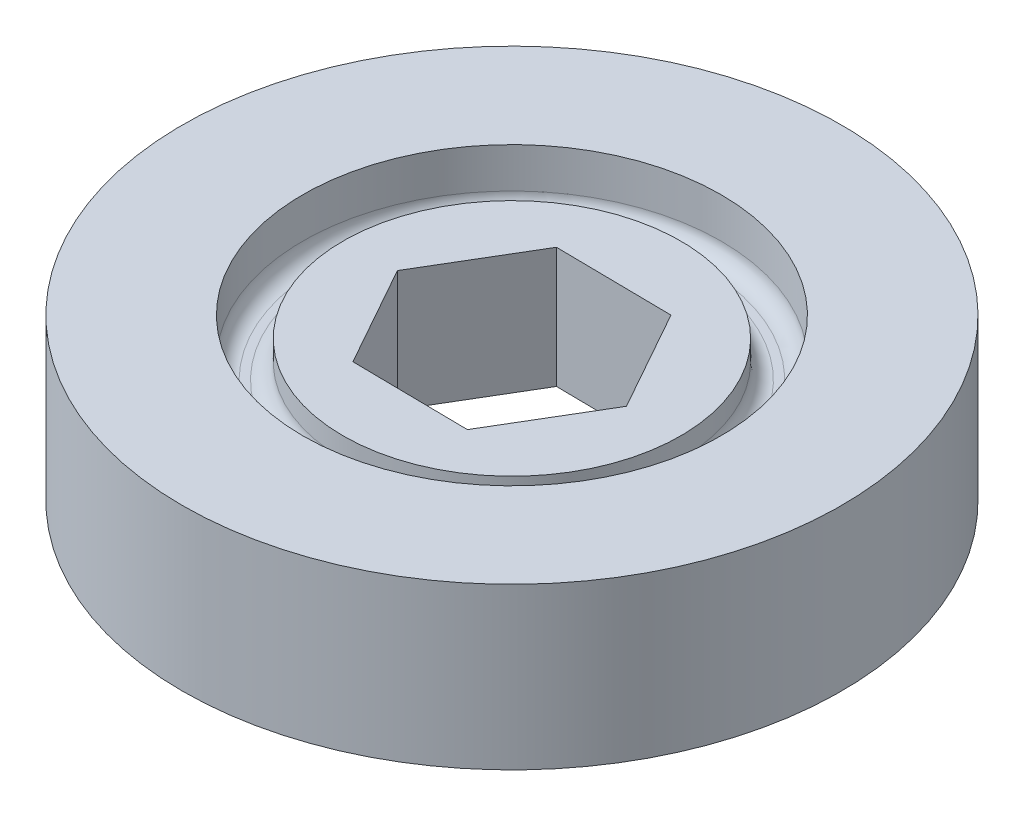
ISO-10303-21;
HEADER;
FILE_DESCRIPTION(('STEP AP214'),'2;1');
FILE_NAME('part.step','',(''),(''),'','','');
FILE_SCHEMA(('AUTOMOTIVE_DESIGN { 1 0 10303 214 1 1 1 1 }'));
ENDSEC;
DATA;
#1=APPLICATION_CONTEXT('core data for automotive mechanical design processes');
#2=APPLICATION_PROTOCOL_DEFINITION('international standard','automotive_design',2000,#1);
#3=PRODUCT_CONTEXT('',#1,'mechanical');
#4=PRODUCT('Part','Part','',(#3));
#5=PRODUCT_RELATED_PRODUCT_CATEGORY('part','',(#4));
#6=PRODUCT_DEFINITION_FORMATION('','',#4);
#7=PRODUCT_DEFINITION_CONTEXT('part definition',#1,'design');
#8=PRODUCT_DEFINITION('design','',#6,#7);
#9=PRODUCT_DEFINITION_SHAPE('','',#8);
#10=(LENGTH_UNIT() NAMED_UNIT(*) SI_UNIT(.MILLI.,.METRE.));
#11=(NAMED_UNIT(*) PLANE_ANGLE_UNIT() SI_UNIT($,.RADIAN.));
#12=(NAMED_UNIT(*) SI_UNIT($,.STERADIAN.) SOLID_ANGLE_UNIT());
#13=UNCERTAINTY_MEASURE_WITH_UNIT(LENGTH_MEASURE(1.E-05),#10,'distance_accuracy_value','');
#14=(GEOMETRIC_REPRESENTATION_CONTEXT(3) GLOBAL_UNCERTAINTY_ASSIGNED_CONTEXT((#13)) GLOBAL_UNIT_ASSIGNED_CONTEXT((#10,
#11,#12)) REPRESENTATION_CONTEXT('',''));
#15=CARTESIAN_POINT('',(0.,0.,0.));
#16=DIRECTION('',(0.,0.,1.));
#17=DIRECTION('',(1.,0.,0.));
#18=AXIS2_PLACEMENT_3D('',#15,#16,#17);
#19=CARTESIAN_POINT('',(0.,10.,0.));
#20=DIRECTION('',(0.,-1.,0.));
#21=DIRECTION('',(0.,0.,-1.));
#22=AXIS2_PLACEMENT_3D('',#19,#20,#21);
#23=CYLINDRICAL_SURFACE('',#22,20.5);
#24=CARTESIAN_POINT('',(0.,10.,0.));
#25=DIRECTION('',(0.,1.,0.));
#26=DIRECTION('',(0.,0.,1.));
#27=AXIS2_PLACEMENT_3D('',#24,#25,#26);
#28=CIRCLE('',#27,20.5);
#29=CARTESIAN_POINT('',(0.,10.,20.5));
#30=VERTEX_POINT('',#29);
#31=EDGE_CURVE('E128',#30,#30,#28,.T.);
#32=ORIENTED_EDGE('',*,*,#31,.F.);
#33=EDGE_LOOP('',(#32));
#34=FACE_BOUND('',#33,.T.);
#35=CARTESIAN_POINT('',(0.,0.,0.));
#36=DIRECTION('',(0.,1.,0.));
#37=DIRECTION('',(0.,0.,1.));
#38=AXIS2_PLACEMENT_3D('',#35,#36,#37);
#39=CIRCLE('',#38,20.5);
#40=CARTESIAN_POINT('',(0.,0.,20.5));
#41=VERTEX_POINT('',#40);
#42=EDGE_CURVE('E127',#41,#41,#39,.T.);
#43=ORIENTED_EDGE('',*,*,#42,.T.);
#44=EDGE_LOOP('',(#43));
#45=FACE_BOUND('',#44,.T.);
#46=ADVANCED_FACE('F33',(#34,#45),#23,.T.);
#47=CARTESIAN_POINT('',(0.,10.,0.));
#48=DIRECTION('',(0.,1.,0.));
#49=DIRECTION('',(0.,0.,1.));
#50=AXIS2_PLACEMENT_3D('',#47,#48,#49);
#51=PLANE('',#50);
#52=CARTESIAN_POINT('',(0.,10.,0.));
#53=DIRECTION('',(0.,1.,0.));
#54=DIRECTION('',(0.,0.,1.));
#55=AXIS2_PLACEMENT_3D('',#52,#53,#54);
#56=CIRCLE('',#55,13.);
#57=CARTESIAN_POINT('',(0.,10.,13.));
#58=VERTEX_POINT('',#57);
#59=EDGE_CURVE('E124',#58,#58,#56,.T.);
#60=ORIENTED_EDGE('',*,*,#59,.F.);
#61=EDGE_LOOP('',(#60));
#62=FACE_BOUND('',#61,.T.);
#63=ORIENTED_EDGE('',*,*,#31,.T.);
#64=EDGE_LOOP('',(#63));
#65=FACE_BOUND('',#64,.T.);
#66=ADVANCED_FACE('F177',(#62,#65),#51,.T.);
#67=CARTESIAN_POINT('',(0.,0.,0.));
#68=DIRECTION('',(0.,1.,0.));
#69=DIRECTION('',(0.,0.,1.));
#70=AXIS2_PLACEMENT_3D('',#67,#68,#69);
#71=PLANE('',#70);
#72=CARTESIAN_POINT('',(0.,0.,0.));
#73=DIRECTION('',(0.,-1.,0.));
#74=DIRECTION('',(0.,0.,-1.));
#75=AXIS2_PLACEMENT_3D('',#72,#73,#74);
#76=CIRCLE('',#75,13.);
#77=CARTESIAN_POINT('',(0.,0.,-13.));
#78=VERTEX_POINT('',#77);
#79=EDGE_CURVE('E121',#78,#78,#76,.T.);
#80=ORIENTED_EDGE('',*,*,#79,.F.);
#81=EDGE_LOOP('',(#80));
#82=FACE_BOUND('',#81,.T.);
#83=ORIENTED_EDGE('',*,*,#42,.F.);
#84=EDGE_LOOP('',(#83));
#85=FACE_BOUND('',#84,.T.);
#86=ADVANCED_FACE('F183',(#82,#85),#71,.F.);
#87=CARTESIAN_POINT('',(0.,6.5,0.));
#88=DIRECTION('',(0.,1.,0.));
#89=DIRECTION('',(0.,0.,1.));
#90=AXIS2_PLACEMENT_3D('',#87,#88,#89);
#91=CYLINDRICAL_SURFACE('',#90,13.);
#92=CARTESIAN_POINT('',(0.,7.5,0.));
#93=DIRECTION('',(0.,1.,0.));
#94=DIRECTION('',(0.,0.,1.));
#95=AXIS2_PLACEMENT_3D('',#92,#93,#94);
#96=CIRCLE('',#95,13.);
#97=CARTESIAN_POINT('',(0.,7.5,13.));
#98=VERTEX_POINT('',#97);
#99=EDGE_CURVE('E153',#98,#98,#96,.F.);
#100=ORIENTED_EDGE('',*,*,#99,.T.);
#101=EDGE_LOOP('',(#100));
#102=FACE_BOUND('',#101,.T.);
#103=ORIENTED_EDGE('',*,*,#59,.T.);
#104=EDGE_LOOP('',(#103));
#105=FACE_BOUND('',#104,.T.);
#106=ADVANCED_FACE('F205',(#102,#105),#91,.F.);
#107=CARTESIAN_POINT('',(0.,6.5,0.));
#108=DIRECTION('',(0.,1.,0.));
#109=DIRECTION('',(0.,0.,1.));
#110=AXIS2_PLACEMENT_3D('',#107,#108,#109);
#111=PLANE('',#110);
#112=CARTESIAN_POINT('',(0.,6.5,0.));
#113=DIRECTION('',(0.,1.,0.));
#114=DIRECTION('',(0.,0.,1.));
#115=AXIS2_PLACEMENT_3D('',#112,#113,#114);
#116=CIRCLE('',#115,11.5);
#117=CARTESIAN_POINT('',(0.,6.5,11.5));
#118=VERTEX_POINT('',#117);
#119=EDGE_CURVE('E11',#118,#118,#116,.F.);
#120=ORIENTED_EDGE('',*,*,#119,.T.);
#121=EDGE_LOOP('',(#120));
#122=FACE_BOUND('',#121,.T.);
#123=CARTESIAN_POINT('',(0.,6.5,0.));
#124=DIRECTION('',(0.,1.,0.));
#125=DIRECTION('',(0.,0.,1.));
#126=AXIS2_PLACEMENT_3D('',#123,#124,#125);
#127=CIRCLE('',#126,12.);
#128=CARTESIAN_POINT('',(0.,6.5,12.));
#129=VERTEX_POINT('',#128);
#130=EDGE_CURVE('E150',#129,#129,#127,.T.);
#131=ORIENTED_EDGE('',*,*,#130,.T.);
#132=EDGE_LOOP('',(#131));
#133=FACE_BOUND('',#132,.T.);
#134=ADVANCED_FACE('F202',(#122,#133),#111,.T.);
#135=CARTESIAN_POINT('',(0.,3.5,0.));
#136=DIRECTION('',(0.,-1.,0.));
#137=DIRECTION('',(0.,0.,-1.));
#138=AXIS2_PLACEMENT_3D('',#135,#136,#137);
#139=CYLINDRICAL_SURFACE('',#138,13.);
#140=CARTESIAN_POINT('',(0.,2.5,0.));
#141=DIRECTION('',(0.,-1.,0.));
#142=DIRECTION('',(0.,0.,-1.));
#143=AXIS2_PLACEMENT_3D('',#140,#141,#142);
#144=CIRCLE('',#143,13.);
#145=CARTESIAN_POINT('',(0.,2.5,-13.));
#146=VERTEX_POINT('',#145);
#147=EDGE_CURVE('E147',#146,#146,#144,.F.);
#148=ORIENTED_EDGE('',*,*,#147,.T.);
#149=EDGE_LOOP('',(#148));
#150=FACE_BOUND('',#149,.T.);
#151=ORIENTED_EDGE('',*,*,#79,.T.);
#152=EDGE_LOOP('',(#151));
#153=FACE_BOUND('',#152,.T.);
#154=ADVANCED_FACE('F204',(#150,#153),#139,.F.);
#155=CARTESIAN_POINT('',(0.,3.5,0.));
#156=DIRECTION('',(0.,-1.,0.));
#157=DIRECTION('',(0.,0.,-1.));
#158=AXIS2_PLACEMENT_3D('',#155,#156,#157);
#159=PLANE('',#158);
#160=CARTESIAN_POINT('',(0.,3.5,0.));
#161=DIRECTION('',(0.,-1.,0.));
#162=DIRECTION('',(0.,0.,-1.));
#163=AXIS2_PLACEMENT_3D('',#160,#161,#162);
#164=CIRCLE('',#163,11.5);
#165=CARTESIAN_POINT('',(0.,3.5,-11.5));
#166=VERTEX_POINT('',#165);
#167=EDGE_CURVE('E159',#166,#166,#164,.F.);
#168=ORIENTED_EDGE('',*,*,#167,.T.);
#169=EDGE_LOOP('',(#168));
#170=FACE_BOUND('',#169,.T.);
#171=CARTESIAN_POINT('',(0.,3.5,0.));
#172=DIRECTION('',(0.,-1.,0.));
#173=DIRECTION('',(0.,0.,-1.));
#174=AXIS2_PLACEMENT_3D('',#171,#172,#173);
#175=CIRCLE('',#174,12.);
#176=CARTESIAN_POINT('',(0.,3.5,-12.));
#177=VERTEX_POINT('',#176);
#178=EDGE_CURVE('E144',#177,#177,#175,.T.);
#179=ORIENTED_EDGE('',*,*,#178,.T.);
#180=EDGE_LOOP('',(#179));
#181=FACE_BOUND('',#180,.T.);
#182=ADVANCED_FACE('F212',(#170,#181),#159,.T.);
#183=CARTESIAN_POINT('',(0.,8.75,0.));
#184=DIRECTION('',(0.,-1.,0.));
#185=DIRECTION('',(0.,0.,-1.));
#186=AXIS2_PLACEMENT_3D('',#183,#184,#185);
#187=CYLINDRICAL_SURFACE('',#186,10.5);
#188=CARTESIAN_POINT('',(0.,7.5,0.));
#189=DIRECTION('',(0.,1.,0.));
#190=DIRECTION('',(0.,0.,1.));
#191=AXIS2_PLACEMENT_3D('',#188,#189,#190);
#192=CIRCLE('',#191,10.5);
#193=CARTESIAN_POINT('',(0.,7.5,10.5));
#194=VERTEX_POINT('',#193);
#195=EDGE_CURVE('E41',#194,#194,#192,.T.);
#196=ORIENTED_EDGE('',*,*,#195,.T.);
#197=EDGE_LOOP('',(#196));
#198=FACE_BOUND('',#197,.T.);
#199=CARTESIAN_POINT('',(0.,8.75,0.));
#200=DIRECTION('',(0.,1.,0.));
#201=DIRECTION('',(0.,0.,1.));
#202=AXIS2_PLACEMENT_3D('',#199,#200,#201);
#203=CIRCLE('',#202,10.5);
#204=CARTESIAN_POINT('',(0.,8.75,10.5));
#205=VERTEX_POINT('',#204);
#206=EDGE_CURVE('E118',#205,#205,#203,.T.);
#207=ORIENTED_EDGE('',*,*,#206,.F.);
#208=EDGE_LOOP('',(#207));
#209=FACE_BOUND('',#208,.T.);
#210=ADVANCED_FACE('F164',(#198,#209),#187,.T.);
#211=CARTESIAN_POINT('',(0.,8.75,0.));
#212=DIRECTION('',(0.,1.,0.));
#213=DIRECTION('',(0.,0.,1.));
#214=AXIS2_PLACEMENT_3D('',#211,#212,#213);
#215=PLANE('',#214);
#216=DIRECTION('',(-0.48866357112851,0.,-0.872472299991199));
#217=VECTOR('',#216,1.);
#218=CARTESIAN_POINT('',(5.45295187494499,8.75,-3.05414731955318));
#219=LINE('',#218,#217);
#220=CARTESIAN_POINT('',(7.2162646520338,8.75,0.0941159133243871));
#221=VERTEX_POINT('',#220);
#222=CARTESIAN_POINT('',(3.68963909785619,8.75,-6.20241055243075));
#223=VERTEX_POINT('',#222);
#224=EDGE_CURVE('E113',#221,#223,#219,.T.);
#225=ORIENTED_EDGE('',*,*,#224,.F.);
#226=DIRECTION('',(0.511251390326361,0.,-0.859431216496913));
#227=VECTOR('',#226,1.);
#228=CARTESIAN_POINT('',(5.3714451031057,8.75,3.19532118953976));
#229=LINE('',#228,#227);
#230=CARTESIAN_POINT('',(3.52662555417761,8.75,6.29652646575513));
#231=VERTEX_POINT('',#230);
#232=EDGE_CURVE('E111',#231,#221,#229,.T.);
#233=ORIENTED_EDGE('',*,*,#232,.F.);
#234=DIRECTION('',(0.99991496145487,0.,0.0130410834942862));
#235=VECTOR('',#234,1.);
#236=CARTESIAN_POINT('',(-0.081506771839289,8.75,6.24946850909294));
#237=LINE('',#236,#235);
#238=CARTESIAN_POINT('',(-3.68963909785619,8.75,6.20241055243075));
#239=VERTEX_POINT('',#238);
#240=EDGE_CURVE('E106',#239,#231,#237,.T.);
#241=ORIENTED_EDGE('',*,*,#240,.F.);
#242=DIRECTION('',(0.488663571128509,0.,0.872472299991199));
#243=VECTOR('',#242,1.);
#244=CARTESIAN_POINT('',(-5.45295187494499,8.75,3.05414731955318));
#245=LINE('',#244,#243);
#246=CARTESIAN_POINT('',(-7.2162646520338,8.75,-0.0941159133243836));
#247=VERTEX_POINT('',#246);
#248=EDGE_CURVE('E104',#247,#239,#245,.T.);
#249=ORIENTED_EDGE('',*,*,#248,.F.);
#250=DIRECTION('',(-0.511251390326361,0.,0.859431216496913));
#251=VECTOR('',#250,1.);
#252=CARTESIAN_POINT('',(-5.3714451031057,8.75,-3.19532118953976));
#253=LINE('',#252,#251);
#254=CARTESIAN_POINT('',(-3.52662555417761,8.75,-6.29652646575513));
#255=VERTEX_POINT('',#254);
#256=EDGE_CURVE('E88',#255,#247,#253,.T.);
#257=ORIENTED_EDGE('',*,*,#256,.F.);
#258=DIRECTION('',(-0.99991496145487,0.,-0.0130410834942866));
#259=VECTOR('',#258,1.);
#260=CARTESIAN_POINT('',(0.0815067718392913,8.75,-6.24946850909294));
#261=LINE('',#260,#259);
#262=EDGE_CURVE('E83',#223,#255,#261,.T.);
#263=ORIENTED_EDGE('',*,*,#262,.F.);
#264=EDGE_LOOP('',(#225,#233,#241,#249,#257,#263));
#265=FACE_BOUND('',#264,.T.);
#266=ORIENTED_EDGE('',*,*,#206,.T.);
#267=EDGE_LOOP('',(#266));
#268=FACE_BOUND('',#267,.T.);
#269=ADVANCED_FACE('F101',(#265,#268),#215,.T.);
#270=CARTESIAN_POINT('',(0.,1.25,0.));
#271=DIRECTION('',(0.,1.,0.));
#272=DIRECTION('',(0.,0.,1.));
#273=AXIS2_PLACEMENT_3D('',#270,#271,#272);
#274=CYLINDRICAL_SURFACE('',#273,10.5);
#275=CARTESIAN_POINT('',(0.,2.5,0.));
#276=DIRECTION('',(0.,-1.,0.));
#277=DIRECTION('',(0.,0.,-1.));
#278=AXIS2_PLACEMENT_3D('',#275,#276,#277);
#279=CIRCLE('',#278,10.5);
#280=CARTESIAN_POINT('',(0.,2.5,-10.5));
#281=VERTEX_POINT('',#280);
#282=EDGE_CURVE('E156',#281,#281,#279,.T.);
#283=ORIENTED_EDGE('',*,*,#282,.T.);
#284=EDGE_LOOP('',(#283));
#285=FACE_BOUND('',#284,.T.);
#286=CARTESIAN_POINT('',(0.,1.25,0.));
#287=DIRECTION('',(0.,-1.,0.));
#288=DIRECTION('',(0.,0.,-1.));
#289=AXIS2_PLACEMENT_3D('',#286,#287,#288);
#290=CIRCLE('',#289,10.5);
#291=CARTESIAN_POINT('',(0.,1.25,-10.5));
#292=VERTEX_POINT('',#291);
#293=EDGE_CURVE('E115',#292,#292,#290,.T.);
#294=ORIENTED_EDGE('',*,*,#293,.F.);
#295=EDGE_LOOP('',(#294));
#296=FACE_BOUND('',#295,.T.);
#297=ADVANCED_FACE('F225',(#285,#296),#274,.T.);
#298=CARTESIAN_POINT('',(0.,1.25,0.));
#299=DIRECTION('',(0.,-1.,0.));
#300=DIRECTION('',(0.,0.,-1.));
#301=AXIS2_PLACEMENT_3D('',#298,#299,#300);
#302=PLANE('',#301);
#303=DIRECTION('',(0.48866357112851,0.,0.872472299991199));
#304=VECTOR('',#303,1.);
#305=CARTESIAN_POINT('',(5.45295187494499,1.25,-3.05414731955318));
#306=LINE('',#305,#304);
#307=CARTESIAN_POINT('',(3.68963909785619,1.25,-6.20241055243075));
#308=VERTEX_POINT('',#307);
#309=CARTESIAN_POINT('',(7.2162646520338,1.25,0.0941159133243871));
#310=VERTEX_POINT('',#309);
#311=EDGE_CURVE('E142',#308,#310,#306,.T.);
#312=ORIENTED_EDGE('',*,*,#311,.F.);
#313=DIRECTION('',(0.99991496145487,0.,0.0130410834942866));
#314=VECTOR('',#313,1.);
#315=CARTESIAN_POINT('',(0.0815067718392913,1.25,-6.24946850909294));
#316=LINE('',#315,#314);
#317=CARTESIAN_POINT('',(-3.52662555417761,1.25,-6.29652646575513));
#318=VERTEX_POINT('',#317);
#319=EDGE_CURVE('E131',#318,#308,#316,.T.);
#320=ORIENTED_EDGE('',*,*,#319,.F.);
#321=DIRECTION('',(0.511251390326361,0.,-0.859431216496913));
#322=VECTOR('',#321,1.);
#323=CARTESIAN_POINT('',(-5.3714451031057,1.25,-3.19532118953976));
#324=LINE('',#323,#322);
#325=CARTESIAN_POINT('',(-7.2162646520338,1.25,-0.0941159133243836));
#326=VERTEX_POINT('',#325);
#327=EDGE_CURVE('E96',#326,#318,#324,.T.);
#328=ORIENTED_EDGE('',*,*,#327,.F.);
#329=DIRECTION('',(-0.488663571128509,0.,-0.872472299991199));
#330=VECTOR('',#329,1.);
#331=CARTESIAN_POINT('',(-5.45295187494499,1.25,3.05414731955318));
#332=LINE('',#331,#330);
#333=CARTESIAN_POINT('',(-3.68963909785619,1.25,6.20241055243075));
#334=VERTEX_POINT('',#333);
#335=EDGE_CURVE('E136',#334,#326,#332,.T.);
#336=ORIENTED_EDGE('',*,*,#335,.F.);
#337=DIRECTION('',(-0.99991496145487,0.,-0.0130410834942862));
#338=VECTOR('',#337,1.);
#339=CARTESIAN_POINT('',(-0.081506771839289,1.25,6.24946850909294));
#340=LINE('',#339,#338);
#341=CARTESIAN_POINT('',(3.52662555417761,1.25,6.29652646575513));
#342=VERTEX_POINT('',#341);
#343=EDGE_CURVE('E138',#342,#334,#340,.T.);
#344=ORIENTED_EDGE('',*,*,#343,.F.);
#345=DIRECTION('',(-0.511251390326361,0.,0.859431216496913));
#346=VECTOR('',#345,1.);
#347=CARTESIAN_POINT('',(5.3714451031057,1.25,3.19532118953976));
#348=LINE('',#347,#346);
#349=EDGE_CURVE('E140',#310,#342,#348,.T.);
#350=ORIENTED_EDGE('',*,*,#349,.F.);
#351=EDGE_LOOP('',(#312,#320,#328,#336,#344,#350));
#352=FACE_BOUND('',#351,.T.);
#353=ORIENTED_EDGE('',*,*,#293,.T.);
#354=EDGE_LOOP('',(#353));
#355=FACE_BOUND('',#354,.T.);
#356=ADVANCED_FACE('F228',(#352,#355),#302,.T.);
#357=CARTESIAN_POINT('',(7.2162646520338,0.,0.0941159133243871));
#358=DIRECTION('',(0.872472299991198,0.,-0.48866357112851));
#359=DIRECTION('',(-0.48866357112851,0.,-0.872472299991199));
#360=AXIS2_PLACEMENT_3D('',#357,#358,#359);
#361=PLANE('',#360);
#362=ORIENTED_EDGE('',*,*,#224,.T.);
#363=DIRECTION('',(0.,1.,0.));
#364=VECTOR('',#363,1.);
#365=CARTESIAN_POINT('',(3.68963909785619,0.,-6.20241055243075));
#366=LINE('',#365,#364);
#367=EDGE_CURVE('E48',#308,#223,#366,.T.);
#368=ORIENTED_EDGE('',*,*,#367,.F.);
#369=ORIENTED_EDGE('',*,*,#311,.T.);
#370=DIRECTION('',(0.,1.,0.));
#371=VECTOR('',#370,1.);
#372=CARTESIAN_POINT('',(7.2162646520338,0.,0.0941159133243871));
#373=LINE('',#372,#371);
#374=EDGE_CURVE('E89',#310,#221,#373,.T.);
#375=ORIENTED_EDGE('',*,*,#374,.T.);
#376=EDGE_LOOP('',(#362,#368,#369,#375));
#377=FACE_BOUND('',#376,.T.);
#378=ADVANCED_FACE('F232',(#377),#361,.F.);
#379=CARTESIAN_POINT('',(3.52662555417761,0.,6.29652646575513));
#380=DIRECTION('',(0.859431216496912,0.,0.511251390326361));
#381=DIRECTION('',(0.511251390326361,0.,-0.859431216496913));
#382=AXIS2_PLACEMENT_3D('',#379,#380,#381);
#383=PLANE('',#382);
#384=ORIENTED_EDGE('',*,*,#232,.T.);
#385=ORIENTED_EDGE('',*,*,#374,.F.);
#386=ORIENTED_EDGE('',*,*,#349,.T.);
#387=DIRECTION('',(0.,1.,0.));
#388=VECTOR('',#387,1.);
#389=CARTESIAN_POINT('',(3.52662555417761,0.,6.29652646575513));
#390=LINE('',#389,#388);
#391=EDGE_CURVE('E260',#342,#231,#390,.T.);
#392=ORIENTED_EDGE('',*,*,#391,.T.);
#393=EDGE_LOOP('',(#384,#385,#386,#392));
#394=FACE_BOUND('',#393,.T.);
#395=ADVANCED_FACE('F236',(#394),#383,.F.);
#396=CARTESIAN_POINT('',(-3.68963909785619,0.,6.20241055243075));
#397=DIRECTION('',(-0.0130410834942862,0.,0.99991496145487));
#398=DIRECTION('',(0.99991496145487,0.,0.0130410834942862));
#399=AXIS2_PLACEMENT_3D('',#396,#397,#398);
#400=PLANE('',#399);
#401=ORIENTED_EDGE('',*,*,#240,.T.);
#402=ORIENTED_EDGE('',*,*,#391,.F.);
#403=ORIENTED_EDGE('',*,*,#343,.T.);
#404=DIRECTION('',(0.,1.,0.));
#405=VECTOR('',#404,1.);
#406=CARTESIAN_POINT('',(-3.68963909785619,0.,6.20241055243075));
#407=LINE('',#406,#405);
#408=EDGE_CURVE('E263',#334,#239,#407,.T.);
#409=ORIENTED_EDGE('',*,*,#408,.T.);
#410=EDGE_LOOP('',(#401,#402,#403,#409));
#411=FACE_BOUND('',#410,.T.);
#412=ADVANCED_FACE('F245',(#411),#400,.F.);
#413=CARTESIAN_POINT('',(-7.2162646520338,0.,-0.0941159133243836));
#414=DIRECTION('',(-0.872472299991199,0.,0.488663571128509));
#415=DIRECTION('',(0.488663571128509,0.,0.872472299991199));
#416=AXIS2_PLACEMENT_3D('',#413,#414,#415);
#417=PLANE('',#416);
#418=ORIENTED_EDGE('',*,*,#248,.T.);
#419=ORIENTED_EDGE('',*,*,#408,.F.);
#420=ORIENTED_EDGE('',*,*,#335,.T.);
#421=DIRECTION('',(0.,1.,0.));
#422=VECTOR('',#421,1.);
#423=CARTESIAN_POINT('',(-7.2162646520338,0.,-0.0941159133243836));
#424=LINE('',#423,#422);
#425=EDGE_CURVE('E98',#326,#247,#424,.T.);
#426=ORIENTED_EDGE('',*,*,#425,.T.);
#427=EDGE_LOOP('',(#418,#419,#420,#426));
#428=FACE_BOUND('',#427,.T.);
#429=ADVANCED_FACE('F242',(#428),#417,.F.);
#430=CARTESIAN_POINT('',(-3.52662555417761,0.,-6.29652646575513));
#431=DIRECTION('',(-0.859431216496912,0.,-0.511251390326361));
#432=DIRECTION('',(-0.511251390326361,0.,0.859431216496913));
#433=AXIS2_PLACEMENT_3D('',#430,#431,#432);
#434=PLANE('',#433);
#435=ORIENTED_EDGE('',*,*,#256,.T.);
#436=ORIENTED_EDGE('',*,*,#425,.F.);
#437=ORIENTED_EDGE('',*,*,#327,.T.);
#438=DIRECTION('',(0.,1.,0.));
#439=VECTOR('',#438,1.);
#440=CARTESIAN_POINT('',(-3.52662555417761,0.,-6.29652646575513));
#441=LINE('',#440,#439);
#442=EDGE_CURVE('E53',#318,#255,#441,.T.);
#443=ORIENTED_EDGE('',*,*,#442,.T.);
#444=EDGE_LOOP('',(#435,#436,#437,#443));
#445=FACE_BOUND('',#444,.T.);
#446=ADVANCED_FACE('F92',(#445),#434,.F.);
#447=CARTESIAN_POINT('',(3.68963909785619,0.,-6.20241055243075));
#448=DIRECTION('',(0.0130410834942866,0.,-0.99991496145487));
#449=DIRECTION('',(-0.99991496145487,0.,-0.0130410834942866));
#450=AXIS2_PLACEMENT_3D('',#447,#448,#449);
#451=PLANE('',#450);
#452=ORIENTED_EDGE('',*,*,#262,.T.);
#453=ORIENTED_EDGE('',*,*,#442,.F.);
#454=ORIENTED_EDGE('',*,*,#319,.T.);
#455=ORIENTED_EDGE('',*,*,#367,.T.);
#456=EDGE_LOOP('',(#452,#453,#454,#455));
#457=FACE_BOUND('',#456,.T.);
#458=ADVANCED_FACE('F84',(#457),#451,.F.);
#459=CARTESIAN_POINT('',(0.,2.5,0.));
#460=DIRECTION('',(0.,-1.,0.));
#461=DIRECTION('',(0.,0.,-1.));
#462=AXIS2_PLACEMENT_3D('',#459,#460,#461);
#463=TOROIDAL_SURFACE('',#462,12.,1.);
#464=ORIENTED_EDGE('',*,*,#147,.F.);
#465=EDGE_LOOP('',(#464));
#466=FACE_BOUND('',#465,.T.);
#467=ORIENTED_EDGE('',*,*,#178,.F.);
#468=EDGE_LOOP('',(#467));
#469=FACE_BOUND('',#468,.T.);
#470=ADVANCED_FACE('F190',(#466,#469),#463,.F.);
#471=CARTESIAN_POINT('',(0.,7.5,0.));
#472=DIRECTION('',(0.,1.,0.));
#473=DIRECTION('',(0.,0.,1.));
#474=AXIS2_PLACEMENT_3D('',#471,#472,#473);
#475=TOROIDAL_SURFACE('',#474,12.,1.);
#476=ORIENTED_EDGE('',*,*,#99,.F.);
#477=EDGE_LOOP('',(#476));
#478=FACE_BOUND('',#477,.T.);
#479=ORIENTED_EDGE('',*,*,#130,.F.);
#480=EDGE_LOOP('',(#479));
#481=FACE_BOUND('',#480,.T.);
#482=ADVANCED_FACE('F173',(#478,#481),#475,.F.);
#483=CARTESIAN_POINT('',(0.,2.5,0.));
#484=DIRECTION('',(0.,-1.,0.));
#485=DIRECTION('',(0.,0.,-1.));
#486=AXIS2_PLACEMENT_3D('',#483,#484,#485);
#487=TOROIDAL_SURFACE('',#486,11.5,1.);
#488=ORIENTED_EDGE('',*,*,#167,.F.);
#489=EDGE_LOOP('',(#488));
#490=FACE_BOUND('',#489,.T.);
#491=ORIENTED_EDGE('',*,*,#282,.F.);
#492=EDGE_LOOP('',(#491));
#493=FACE_BOUND('',#492,.T.);
#494=ADVANCED_FACE('F168',(#490,#493),#487,.F.);
#495=CARTESIAN_POINT('',(0.,7.5,0.));
#496=DIRECTION('',(0.,1.,0.));
#497=DIRECTION('',(0.,0.,1.));
#498=AXIS2_PLACEMENT_3D('',#495,#496,#497);
#499=TOROIDAL_SURFACE('',#498,11.5,1.);
#500=ORIENTED_EDGE('',*,*,#119,.F.);
#501=EDGE_LOOP('',(#500));
#502=FACE_BOUND('',#501,.T.);
#503=ORIENTED_EDGE('',*,*,#195,.F.);
#504=EDGE_LOOP('',(#503));
#505=FACE_BOUND('',#504,.T.);
#506=ADVANCED_FACE('F35',(#502,#505),#499,.F.);
#507=CLOSED_SHELL('',(#46,#66,#86,#106,#134,#154,#182,#210,#269,#297,#356,#378,#395,#412,#429,
#446,#458,#470,#482,#494,#506));
#508=MANIFOLD_SOLID_BREP('B2',#507);
#509=ADVANCED_BREP_SHAPE_REPRESENTATION('',(#18,#508),#14);
#510=SHAPE_DEFINITION_REPRESENTATION(#9,#509);
ENDSEC;
END-ISO-10303-21;
